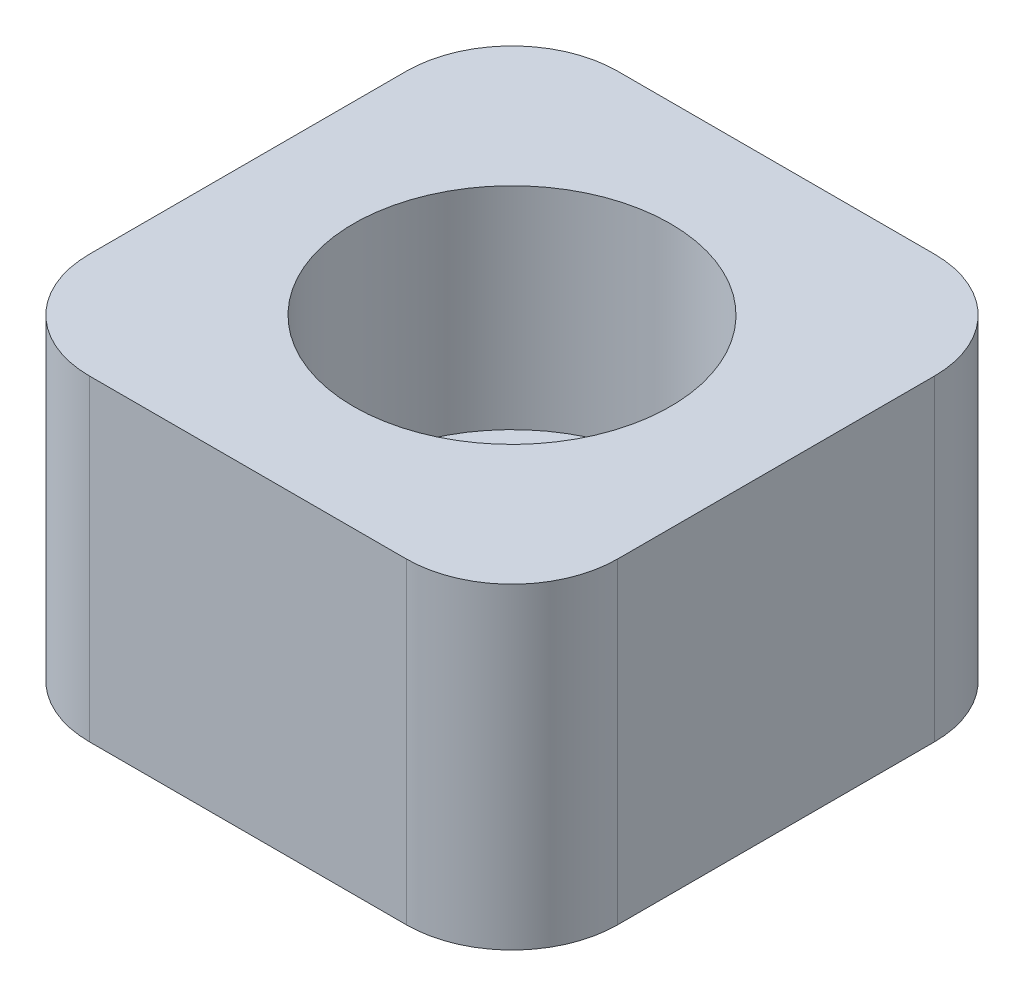
ISO-10303-21;
HEADER;
FILE_DESCRIPTION(('STEP AP214'),'2;1');
FILE_NAME('part.step','',(''),(''),'','','');
FILE_SCHEMA(('AUTOMOTIVE_DESIGN { 1 0 10303 214 1 1 1 1 }'));
ENDSEC;
DATA;
#1=APPLICATION_CONTEXT('core data for automotive mechanical design processes');
#2=APPLICATION_PROTOCOL_DEFINITION('international standard','automotive_design',2000,#1);
#3=PRODUCT_CONTEXT('',#1,'mechanical');
#4=PRODUCT('Part','Part','',(#3));
#5=PRODUCT_RELATED_PRODUCT_CATEGORY('part','',(#4));
#6=PRODUCT_DEFINITION_FORMATION('','',#4);
#7=PRODUCT_DEFINITION_CONTEXT('part definition',#1,'design');
#8=PRODUCT_DEFINITION('design','',#6,#7);
#9=PRODUCT_DEFINITION_SHAPE('','',#8);
#10=(LENGTH_UNIT() NAMED_UNIT(*) SI_UNIT(.MILLI.,.METRE.));
#11=(NAMED_UNIT(*) PLANE_ANGLE_UNIT() SI_UNIT($,.RADIAN.));
#12=(NAMED_UNIT(*) SI_UNIT($,.STERADIAN.) SOLID_ANGLE_UNIT());
#13=UNCERTAINTY_MEASURE_WITH_UNIT(LENGTH_MEASURE(1.E-05),#10,'distance_accuracy_value','');
#14=(GEOMETRIC_REPRESENTATION_CONTEXT(3) GLOBAL_UNCERTAINTY_ASSIGNED_CONTEXT((#13)) GLOBAL_UNIT_ASSIGNED_CONTEXT((#10,
#11,#12)) REPRESENTATION_CONTEXT('',''));
#15=CARTESIAN_POINT('',(0.,0.,0.));
#16=DIRECTION('',(0.,0.,1.));
#17=DIRECTION('',(1.,0.,0.));
#18=AXIS2_PLACEMENT_3D('',#15,#16,#17);
#19=CARTESIAN_POINT('',(25.,30.,25.));
#20=DIRECTION('',(-1.,0.,0.));
#21=DIRECTION('',(0.,0.,1.));
#22=AXIS2_PLACEMENT_3D('',#19,#20,#21);
#23=PLANE('',#22);
#24=DIRECTION('',(0.,0.,-1.));
#25=VECTOR('',#24,1.);
#26=CARTESIAN_POINT('',(25.,30.,25.));
#27=LINE('',#26,#25);
#28=CARTESIAN_POINT('',(25.,30.,15.));
#29=VERTEX_POINT('',#28);
#30=CARTESIAN_POINT('',(25.,30.,-15.));
#31=VERTEX_POINT('',#30);
#32=EDGE_CURVE('E134',#29,#31,#27,.T.);
#33=ORIENTED_EDGE('',*,*,#32,.F.);
#34=DIRECTION('',(0.,-1.,0.));
#35=VECTOR('',#34,1.);
#36=CARTESIAN_POINT('',(25.,30.,15.));
#37=LINE('',#36,#35);
#38=CARTESIAN_POINT('',(25.,0.,15.));
#39=VERTEX_POINT('',#38);
#40=EDGE_CURVE('E173',#29,#39,#37,.T.);
#41=ORIENTED_EDGE('',*,*,#40,.T.);
#42=DIRECTION('',(0.,0.,-1.));
#43=VECTOR('',#42,1.);
#44=CARTESIAN_POINT('',(25.,0.,25.));
#45=LINE('',#44,#43);
#46=CARTESIAN_POINT('',(25.,0.,-15.));
#47=VERTEX_POINT('',#46);
#48=EDGE_CURVE('E188',#39,#47,#45,.T.);
#49=ORIENTED_EDGE('',*,*,#48,.T.);
#50=DIRECTION('',(0.,-1.,0.));
#51=VECTOR('',#50,1.);
#52=CARTESIAN_POINT('',(25.,30.,-15.));
#53=LINE('',#52,#51);
#54=EDGE_CURVE('E170',#47,#31,#53,.F.);
#55=ORIENTED_EDGE('',*,*,#54,.T.);
#56=EDGE_LOOP('',(#33,#41,#49,#55));
#57=FACE_BOUND('',#56,.T.);
#58=ADVANCED_FACE('F38',(#57),#23,.F.);
#59=CARTESIAN_POINT('',(-25.,30.,-25.));
#60=DIRECTION('',(0.,0.,1.));
#61=DIRECTION('',(1.,0.,0.));
#62=AXIS2_PLACEMENT_3D('',#59,#60,#61);
#63=PLANE('',#62);
#64=DIRECTION('',(-1.,0.,0.));
#65=VECTOR('',#64,1.);
#66=CARTESIAN_POINT('',(-25.,30.,-25.));
#67=LINE('',#66,#65);
#68=CARTESIAN_POINT('',(15.,30.,-25.));
#69=VERTEX_POINT('',#68);
#70=CARTESIAN_POINT('',(-15.,30.,-25.));
#71=VERTEX_POINT('',#70);
#72=EDGE_CURVE('E139',#69,#71,#67,.T.);
#73=ORIENTED_EDGE('',*,*,#72,.F.);
#74=DIRECTION('',(0.,-1.,0.));
#75=VECTOR('',#74,1.);
#76=CARTESIAN_POINT('',(15.,30.,-25.));
#77=LINE('',#76,#75);
#78=CARTESIAN_POINT('',(15.,0.,-25.));
#79=VERTEX_POINT('',#78);
#80=EDGE_CURVE('E11',#69,#79,#77,.T.);
#81=ORIENTED_EDGE('',*,*,#80,.T.);
#82=DIRECTION('',(-1.,0.,0.));
#83=VECTOR('',#82,1.);
#84=CARTESIAN_POINT('',(-25.,0.,-25.));
#85=LINE('',#84,#83);
#86=CARTESIAN_POINT('',(-15.,0.,-25.));
#87=VERTEX_POINT('',#86);
#88=EDGE_CURVE('E141',#79,#87,#85,.T.);
#89=ORIENTED_EDGE('',*,*,#88,.T.);
#90=DIRECTION('',(0.,-1.,0.));
#91=VECTOR('',#90,1.);
#92=CARTESIAN_POINT('',(-15.,30.,-25.));
#93=LINE('',#92,#91);
#94=EDGE_CURVE('E47',#87,#71,#93,.F.);
#95=ORIENTED_EDGE('',*,*,#94,.T.);
#96=EDGE_LOOP('',(#73,#81,#89,#95));
#97=FACE_BOUND('',#96,.T.);
#98=ADVANCED_FACE('F194',(#97),#63,.F.);
#99=CARTESIAN_POINT('',(-25.,30.,25.));
#100=DIRECTION('',(1.,0.,0.));
#101=DIRECTION('',(0.,0.,-1.));
#102=AXIS2_PLACEMENT_3D('',#99,#100,#101);
#103=PLANE('',#102);
#104=DIRECTION('',(0.,0.,1.));
#105=VECTOR('',#104,1.);
#106=CARTESIAN_POINT('',(-25.,0.,25.));
#107=LINE('',#106,#105);
#108=CARTESIAN_POINT('',(-25.,0.,-15.));
#109=VERTEX_POINT('',#108);
#110=CARTESIAN_POINT('',(-25.,0.,15.));
#111=VERTEX_POINT('',#110);
#112=EDGE_CURVE('E135',#109,#111,#107,.T.);
#113=ORIENTED_EDGE('',*,*,#112,.T.);
#114=DIRECTION('',(0.,-1.,0.));
#115=VECTOR('',#114,1.);
#116=CARTESIAN_POINT('',(-25.,30.,15.));
#117=LINE('',#116,#115);
#118=CARTESIAN_POINT('',(-25.,30.,15.));
#119=VERTEX_POINT('',#118);
#120=EDGE_CURVE('E110',#111,#119,#117,.F.);
#121=ORIENTED_EDGE('',*,*,#120,.T.);
#122=DIRECTION('',(0.,0.,1.));
#123=VECTOR('',#122,1.);
#124=CARTESIAN_POINT('',(-25.,30.,25.));
#125=LINE('',#124,#123);
#126=CARTESIAN_POINT('',(-25.,30.,-15.));
#127=VERTEX_POINT('',#126);
#128=EDGE_CURVE('E179',#127,#119,#125,.T.);
#129=ORIENTED_EDGE('',*,*,#128,.F.);
#130=DIRECTION('',(0.,-1.,0.));
#131=VECTOR('',#130,1.);
#132=CARTESIAN_POINT('',(-25.,30.,-15.));
#133=LINE('',#132,#131);
#134=EDGE_CURVE('E116',#127,#109,#133,.T.);
#135=ORIENTED_EDGE('',*,*,#134,.T.);
#136=EDGE_LOOP('',(#113,#121,#129,#135));
#137=FACE_BOUND('',#136,.T.);
#138=ADVANCED_FACE('F201',(#137),#103,.F.);
#139=CARTESIAN_POINT('',(-25.,30.,25.));
#140=DIRECTION('',(0.,0.,-1.));
#141=DIRECTION('',(-1.,0.,0.));
#142=AXIS2_PLACEMENT_3D('',#139,#140,#141);
#143=PLANE('',#142);
#144=DIRECTION('',(1.,0.,0.));
#145=VECTOR('',#144,1.);
#146=CARTESIAN_POINT('',(-25.,30.,25.));
#147=LINE('',#146,#145);
#148=CARTESIAN_POINT('',(-15.,30.,25.));
#149=VERTEX_POINT('',#148);
#150=CARTESIAN_POINT('',(15.,30.,25.));
#151=VERTEX_POINT('',#150);
#152=EDGE_CURVE('E126',#149,#151,#147,.T.);
#153=ORIENTED_EDGE('',*,*,#152,.F.);
#154=DIRECTION('',(0.,-1.,0.));
#155=VECTOR('',#154,1.);
#156=CARTESIAN_POINT('',(-15.,30.,25.));
#157=LINE('',#156,#155);
#158=CARTESIAN_POINT('',(-15.,0.,25.));
#159=VERTEX_POINT('',#158);
#160=EDGE_CURVE('E109',#149,#159,#157,.T.);
#161=ORIENTED_EDGE('',*,*,#160,.T.);
#162=DIRECTION('',(1.,0.,0.));
#163=VECTOR('',#162,1.);
#164=CARTESIAN_POINT('',(-25.,0.,25.));
#165=LINE('',#164,#163);
#166=CARTESIAN_POINT('',(15.,0.,25.));
#167=VERTEX_POINT('',#166);
#168=EDGE_CURVE('E123',#159,#167,#165,.T.);
#169=ORIENTED_EDGE('',*,*,#168,.T.);
#170=DIRECTION('',(0.,-1.,0.));
#171=VECTOR('',#170,1.);
#172=CARTESIAN_POINT('',(15.,30.,25.));
#173=LINE('',#172,#171);
#174=EDGE_CURVE('E129',#167,#151,#173,.F.);
#175=ORIENTED_EDGE('',*,*,#174,.T.);
#176=EDGE_LOOP('',(#153,#161,#169,#175));
#177=FACE_BOUND('',#176,.T.);
#178=ADVANCED_FACE('F122',(#177),#143,.F.);
#179=CARTESIAN_POINT('',(0.,30.,0.));
#180=DIRECTION('',(0.,-1.,0.));
#181=DIRECTION('',(0.,0.,-1.));
#182=AXIS2_PLACEMENT_3D('',#179,#180,#181);
#183=PLANE('',#182);
#184=CARTESIAN_POINT('',(0.,30.,0.));
#185=DIRECTION('',(0.,1.,0.));
#186=DIRECTION('',(0.,0.,1.));
#187=AXIS2_PLACEMENT_3D('',#184,#185,#186);
#188=CIRCLE('',#187,15.);
#189=CARTESIAN_POINT('',(0.,30.,15.));
#190=VERTEX_POINT('',#189);
#191=EDGE_CURVE('E286',#190,#190,#188,.T.);
#192=ORIENTED_EDGE('',*,*,#191,.F.);
#193=EDGE_LOOP('',(#192));
#194=FACE_BOUND('',#193,.T.);
#195=ORIENTED_EDGE('',*,*,#128,.T.);
#196=CARTESIAN_POINT('',(-15.,30.,15.));
#197=DIRECTION('',(0.,-1.,0.));
#198=DIRECTION('',(0.,0.,-1.));
#199=AXIS2_PLACEMENT_3D('',#196,#197,#198);
#200=CIRCLE('',#199,10.);
#201=EDGE_CURVE('E167',#119,#149,#200,.F.);
#202=ORIENTED_EDGE('',*,*,#201,.T.);
#203=ORIENTED_EDGE('',*,*,#152,.T.);
#204=CARTESIAN_POINT('',(15.,30.,15.));
#205=DIRECTION('',(0.,-1.,0.));
#206=DIRECTION('',(0.,0.,-1.));
#207=AXIS2_PLACEMENT_3D('',#204,#205,#206);
#208=CIRCLE('',#207,10.);
#209=EDGE_CURVE('E164',#151,#29,#208,.F.);
#210=ORIENTED_EDGE('',*,*,#209,.T.);
#211=ORIENTED_EDGE('',*,*,#32,.T.);
#212=CARTESIAN_POINT('',(15.,30.,-15.));
#213=DIRECTION('',(0.,-1.,0.));
#214=DIRECTION('',(0.,0.,-1.));
#215=AXIS2_PLACEMENT_3D('',#212,#213,#214);
#216=CIRCLE('',#215,10.);
#217=EDGE_CURVE('E60',#31,#69,#216,.F.);
#218=ORIENTED_EDGE('',*,*,#217,.T.);
#219=ORIENTED_EDGE('',*,*,#72,.T.);
#220=CARTESIAN_POINT('',(-15.,30.,-15.));
#221=DIRECTION('',(0.,-1.,0.));
#222=DIRECTION('',(0.,0.,-1.));
#223=AXIS2_PLACEMENT_3D('',#220,#221,#222);
#224=CIRCLE('',#223,10.);
#225=EDGE_CURVE('E159',#71,#127,#224,.F.);
#226=ORIENTED_EDGE('',*,*,#225,.T.);
#227=EDGE_LOOP('',(#195,#202,#203,#210,#211,#218,#219,#226));
#228=FACE_BOUND('',#227,.T.);
#229=ADVANCED_FACE('F199',(#194,#228),#183,.F.);
#230=CARTESIAN_POINT('',(0.,0.,0.));
#231=DIRECTION('',(0.,-1.,0.));
#232=DIRECTION('',(0.,0.,-1.));
#233=AXIS2_PLACEMENT_3D('',#230,#231,#232);
#234=PLANE('',#233);
#235=CARTESIAN_POINT('',(15.,0.,15.));
#236=DIRECTION('',(0.,-1.,0.));
#237=DIRECTION('',(0.,0.,-1.));
#238=AXIS2_PLACEMENT_3D('',#235,#236,#237);
#239=CIRCLE('',#238,3.);
#240=CARTESIAN_POINT('',(15.,0.,12.));
#241=VERTEX_POINT('',#240);
#242=EDGE_CURVE('E267',#241,#241,#239,.T.);
#243=ORIENTED_EDGE('',*,*,#242,.F.);
#244=EDGE_LOOP('',(#243));
#245=FACE_BOUND('',#244,.T.);
#246=CARTESIAN_POINT('',(-15.,0.,15.));
#247=DIRECTION('',(0.,-1.,0.));
#248=DIRECTION('',(0.,0.,-1.));
#249=AXIS2_PLACEMENT_3D('',#246,#247,#248);
#250=CIRCLE('',#249,3.);
#251=CARTESIAN_POINT('',(-15.,0.,12.));
#252=VERTEX_POINT('',#251);
#253=EDGE_CURVE('E271',#252,#252,#250,.T.);
#254=ORIENTED_EDGE('',*,*,#253,.F.);
#255=EDGE_LOOP('',(#254));
#256=FACE_BOUND('',#255,.T.);
#257=CARTESIAN_POINT('',(-15.,0.,-15.));
#258=DIRECTION('',(0.,-1.,0.));
#259=DIRECTION('',(0.,0.,-1.));
#260=AXIS2_PLACEMENT_3D('',#257,#258,#259);
#261=CIRCLE('',#260,3.);
#262=CARTESIAN_POINT('',(-15.,0.,-18.));
#263=VERTEX_POINT('',#262);
#264=EDGE_CURVE('E275',#263,#263,#261,.T.);
#265=ORIENTED_EDGE('',*,*,#264,.F.);
#266=EDGE_LOOP('',(#265));
#267=FACE_BOUND('',#266,.T.);
#268=CARTESIAN_POINT('',(15.,0.,-15.));
#269=DIRECTION('',(0.,-1.,0.));
#270=DIRECTION('',(0.,0.,-1.));
#271=AXIS2_PLACEMENT_3D('',#268,#269,#270);
#272=CIRCLE('',#271,3.);
#273=CARTESIAN_POINT('',(15.,0.,-18.));
#274=VERTEX_POINT('',#273);
#275=EDGE_CURVE('E278',#274,#274,#272,.T.);
#276=ORIENTED_EDGE('',*,*,#275,.F.);
#277=EDGE_LOOP('',(#276));
#278=FACE_BOUND('',#277,.T.);
#279=ORIENTED_EDGE('',*,*,#168,.F.);
#280=CARTESIAN_POINT('',(-15.,0.,15.));
#281=DIRECTION('',(0.,-1.,0.));
#282=DIRECTION('',(0.,0.,-1.));
#283=AXIS2_PLACEMENT_3D('',#280,#281,#282);
#284=CIRCLE('',#283,10.);
#285=EDGE_CURVE('E105',#159,#111,#284,.T.);
#286=ORIENTED_EDGE('',*,*,#285,.T.);
#287=ORIENTED_EDGE('',*,*,#112,.F.);
#288=CARTESIAN_POINT('',(-15.,0.,-15.));
#289=DIRECTION('',(0.,-1.,0.));
#290=DIRECTION('',(0.,0.,-1.));
#291=AXIS2_PLACEMENT_3D('',#288,#289,#290);
#292=CIRCLE('',#291,10.);
#293=EDGE_CURVE('E128',#109,#87,#292,.T.);
#294=ORIENTED_EDGE('',*,*,#293,.T.);
#295=ORIENTED_EDGE('',*,*,#88,.F.);
#296=CARTESIAN_POINT('',(15.,0.,-15.));
#297=DIRECTION('',(0.,-1.,0.));
#298=DIRECTION('',(0.,0.,-1.));
#299=AXIS2_PLACEMENT_3D('',#296,#297,#298);
#300=CIRCLE('',#299,10.);
#301=EDGE_CURVE('E149',#79,#47,#300,.T.);
#302=ORIENTED_EDGE('',*,*,#301,.T.);
#303=ORIENTED_EDGE('',*,*,#48,.F.);
#304=CARTESIAN_POINT('',(15.,0.,15.));
#305=DIRECTION('',(0.,-1.,0.));
#306=DIRECTION('',(0.,0.,-1.));
#307=AXIS2_PLACEMENT_3D('',#304,#305,#306);
#308=CIRCLE('',#307,10.);
#309=EDGE_CURVE('E117',#39,#167,#308,.T.);
#310=ORIENTED_EDGE('',*,*,#309,.T.);
#311=EDGE_LOOP('',(#279,#286,#287,#294,#295,#302,#303,#310));
#312=FACE_BOUND('',#311,.T.);
#313=ADVANCED_FACE('F131',(#245,#256,#267,#278,#312),#234,.T.);
#314=CARTESIAN_POINT('',(0.,10.,0.));
#315=DIRECTION('',(0.,1.,0.));
#316=DIRECTION('',(0.,0.,1.));
#317=AXIS2_PLACEMENT_3D('',#314,#315,#316);
#318=CYLINDRICAL_SURFACE('',#317,15.);
#319=CARTESIAN_POINT('',(0.,10.,0.));
#320=DIRECTION('',(0.,1.,0.));
#321=DIRECTION('',(0.,0.,1.));
#322=AXIS2_PLACEMENT_3D('',#319,#320,#321);
#323=CIRCLE('',#322,15.);
#324=CARTESIAN_POINT('',(0.,10.,15.));
#325=VERTEX_POINT('',#324);
#326=EDGE_CURVE('E191',#325,#325,#323,.T.);
#327=ORIENTED_EDGE('',*,*,#326,.F.);
#328=EDGE_LOOP('',(#327));
#329=FACE_BOUND('',#328,.T.);
#330=ORIENTED_EDGE('',*,*,#191,.T.);
#331=EDGE_LOOP('',(#330));
#332=FACE_BOUND('',#331,.T.);
#333=ADVANCED_FACE('F252',(#329,#332),#318,.F.);
#334=CARTESIAN_POINT('',(0.,10.,0.));
#335=DIRECTION('',(0.,1.,0.));
#336=DIRECTION('',(0.,0.,1.));
#337=AXIS2_PLACEMENT_3D('',#334,#335,#336);
#338=PLANE('',#337);
#339=ORIENTED_EDGE('',*,*,#326,.T.);
#340=EDGE_LOOP('',(#339));
#341=FACE_BOUND('',#340,.T.);
#342=ADVANCED_FACE('F221',(#341),#338,.T.);
#343=CARTESIAN_POINT('',(-15.,30.,15.));
#344=DIRECTION('',(0.,-1.,0.));
#345=DIRECTION('',(0.,0.,-1.));
#346=AXIS2_PLACEMENT_3D('',#343,#344,#345);
#347=CYLINDRICAL_SURFACE('',#346,10.);
#348=ORIENTED_EDGE('',*,*,#201,.F.);
#349=ORIENTED_EDGE('',*,*,#120,.F.);
#350=ORIENTED_EDGE('',*,*,#285,.F.);
#351=ORIENTED_EDGE('',*,*,#160,.F.);
#352=EDGE_LOOP('',(#348,#349,#350,#351));
#353=FACE_BOUND('',#352,.T.);
#354=ADVANCED_FACE('F108',(#353),#347,.T.);
#355=CARTESIAN_POINT('',(15.,30.,15.));
#356=DIRECTION('',(0.,-1.,0.));
#357=DIRECTION('',(0.,0.,-1.));
#358=AXIS2_PLACEMENT_3D('',#355,#356,#357);
#359=CYLINDRICAL_SURFACE('',#358,10.);
#360=ORIENTED_EDGE('',*,*,#209,.F.);
#361=ORIENTED_EDGE('',*,*,#174,.F.);
#362=ORIENTED_EDGE('',*,*,#309,.F.);
#363=ORIENTED_EDGE('',*,*,#40,.F.);
#364=EDGE_LOOP('',(#360,#361,#362,#363));
#365=FACE_BOUND('',#364,.T.);
#366=ADVANCED_FACE('F220',(#365),#359,.T.);
#367=CARTESIAN_POINT('',(15.,30.,-15.));
#368=DIRECTION('',(0.,-1.,0.));
#369=DIRECTION('',(0.,0.,-1.));
#370=AXIS2_PLACEMENT_3D('',#367,#368,#369);
#371=CYLINDRICAL_SURFACE('',#370,10.);
#372=ORIENTED_EDGE('',*,*,#217,.F.);
#373=ORIENTED_EDGE('',*,*,#54,.F.);
#374=ORIENTED_EDGE('',*,*,#301,.F.);
#375=ORIENTED_EDGE('',*,*,#80,.F.);
#376=EDGE_LOOP('',(#372,#373,#374,#375));
#377=FACE_BOUND('',#376,.T.);
#378=ADVANCED_FACE('F223',(#377),#371,.T.);
#379=CARTESIAN_POINT('',(-15.,30.,-15.));
#380=DIRECTION('',(0.,-1.,0.));
#381=DIRECTION('',(0.,0.,-1.));
#382=AXIS2_PLACEMENT_3D('',#379,#380,#381);
#383=CYLINDRICAL_SURFACE('',#382,10.);
#384=ORIENTED_EDGE('',*,*,#225,.F.);
#385=ORIENTED_EDGE('',*,*,#94,.F.);
#386=ORIENTED_EDGE('',*,*,#293,.F.);
#387=ORIENTED_EDGE('',*,*,#134,.F.);
#388=EDGE_LOOP('',(#384,#385,#386,#387));
#389=FACE_BOUND('',#388,.T.);
#390=ADVANCED_FACE('F40',(#389),#383,.T.);
#391=CARTESIAN_POINT('',(15.,10.,-15.));
#392=DIRECTION('',(0.,-1.,0.));
#393=DIRECTION('',(0.,0.,-1.));
#394=AXIS2_PLACEMENT_3D('',#391,#392,#393);
#395=CYLINDRICAL_SURFACE('',#394,3.);
#396=CARTESIAN_POINT('',(15.,10.,-15.));
#397=DIRECTION('',(0.,-1.,0.));
#398=DIRECTION('',(0.,0.,-1.));
#399=AXIS2_PLACEMENT_3D('',#396,#397,#398);
#400=CIRCLE('',#399,3.);
#401=CARTESIAN_POINT('',(15.,10.,-18.));
#402=VERTEX_POINT('',#401);
#403=EDGE_CURVE('E280',#402,#402,#400,.T.);
#404=ORIENTED_EDGE('',*,*,#403,.F.);
#405=EDGE_LOOP('',(#404));
#406=FACE_BOUND('',#405,.T.);
#407=ORIENTED_EDGE('',*,*,#275,.T.);
#408=EDGE_LOOP('',(#407));
#409=FACE_BOUND('',#408,.T.);
#410=ADVANCED_FACE('F230',(#406,#409),#395,.F.);
#411=CARTESIAN_POINT('',(15.,10.,-15.));
#412=DIRECTION('',(0.,-1.,0.));
#413=DIRECTION('',(0.,0.,-1.));
#414=AXIS2_PLACEMENT_3D('',#411,#412,#413);
#415=PLANE('',#414);
#416=ORIENTED_EDGE('',*,*,#403,.T.);
#417=EDGE_LOOP('',(#416));
#418=FACE_BOUND('',#417,.T.);
#419=ADVANCED_FACE('F237',(#418),#415,.T.);
#420=CARTESIAN_POINT('',(-15.,10.,-15.));
#421=DIRECTION('',(0.,-1.,0.));
#422=DIRECTION('',(0.,0.,-1.));
#423=AXIS2_PLACEMENT_3D('',#420,#421,#422);
#424=CYLINDRICAL_SURFACE('',#423,3.);
#425=CARTESIAN_POINT('',(-15.,10.,-15.));
#426=DIRECTION('',(0.,-1.,0.));
#427=DIRECTION('',(0.,0.,-1.));
#428=AXIS2_PLACEMENT_3D('',#425,#426,#427);
#429=CIRCLE('',#428,3.);
#430=CARTESIAN_POINT('',(-15.,10.,-18.));
#431=VERTEX_POINT('',#430);
#432=EDGE_CURVE('E281',#431,#431,#429,.T.);
#433=ORIENTED_EDGE('',*,*,#432,.F.);
#434=EDGE_LOOP('',(#433));
#435=FACE_BOUND('',#434,.T.);
#436=ORIENTED_EDGE('',*,*,#264,.T.);
#437=EDGE_LOOP('',(#436));
#438=FACE_BOUND('',#437,.T.);
#439=ADVANCED_FACE('F243',(#435,#438),#424,.F.);
#440=CARTESIAN_POINT('',(-15.,10.,-15.));
#441=DIRECTION('',(0.,-1.,0.));
#442=DIRECTION('',(0.,0.,-1.));
#443=AXIS2_PLACEMENT_3D('',#440,#441,#442);
#444=PLANE('',#443);
#445=ORIENTED_EDGE('',*,*,#432,.T.);
#446=EDGE_LOOP('',(#445));
#447=FACE_BOUND('',#446,.T.);
#448=ADVANCED_FACE('F314',(#447),#444,.T.);
#449=CARTESIAN_POINT('',(-15.,10.,15.));
#450=DIRECTION('',(0.,-1.,0.));
#451=DIRECTION('',(0.,0.,-1.));
#452=AXIS2_PLACEMENT_3D('',#449,#450,#451);
#453=CYLINDRICAL_SURFACE('',#452,3.);
#454=CARTESIAN_POINT('',(-15.,10.,15.));
#455=DIRECTION('',(0.,-1.,0.));
#456=DIRECTION('',(0.,0.,-1.));
#457=AXIS2_PLACEMENT_3D('',#454,#455,#456);
#458=CIRCLE('',#457,3.);
#459=CARTESIAN_POINT('',(-15.,10.,12.));
#460=VERTEX_POINT('',#459);
#461=EDGE_CURVE('E307',#460,#460,#458,.T.);
#462=ORIENTED_EDGE('',*,*,#461,.F.);
#463=EDGE_LOOP('',(#462));
#464=FACE_BOUND('',#463,.T.);
#465=ORIENTED_EDGE('',*,*,#253,.T.);
#466=EDGE_LOOP('',(#465));
#467=FACE_BOUND('',#466,.T.);
#468=ADVANCED_FACE('F320',(#464,#467),#453,.F.);
#469=CARTESIAN_POINT('',(-15.,10.,15.));
#470=DIRECTION('',(0.,-1.,0.));
#471=DIRECTION('',(0.,0.,-1.));
#472=AXIS2_PLACEMENT_3D('',#469,#470,#471);
#473=PLANE('',#472);
#474=ORIENTED_EDGE('',*,*,#461,.T.);
#475=EDGE_LOOP('',(#474));
#476=FACE_BOUND('',#475,.T.);
#477=ADVANCED_FACE('F325',(#476),#473,.T.);
#478=CARTESIAN_POINT('',(15.,10.,15.));
#479=DIRECTION('',(0.,-1.,0.));
#480=DIRECTION('',(0.,0.,-1.));
#481=AXIS2_PLACEMENT_3D('',#478,#479,#480);
#482=CYLINDRICAL_SURFACE('',#481,3.);
#483=CARTESIAN_POINT('',(15.,10.,15.));
#484=DIRECTION('',(0.,-1.,0.));
#485=DIRECTION('',(0.,0.,-1.));
#486=AXIS2_PLACEMENT_3D('',#483,#484,#485);
#487=CIRCLE('',#486,3.);
#488=CARTESIAN_POINT('',(15.,10.,12.));
#489=VERTEX_POINT('',#488);
#490=EDGE_CURVE('E301',#489,#489,#487,.T.);
#491=ORIENTED_EDGE('',*,*,#490,.F.);
#492=EDGE_LOOP('',(#491));
#493=FACE_BOUND('',#492,.T.);
#494=ORIENTED_EDGE('',*,*,#242,.T.);
#495=EDGE_LOOP('',(#494));
#496=FACE_BOUND('',#495,.T.);
#497=ADVANCED_FACE('F328',(#493,#496),#482,.F.);
#498=CARTESIAN_POINT('',(15.,10.,15.));
#499=DIRECTION('',(0.,-1.,0.));
#500=DIRECTION('',(0.,0.,-1.));
#501=AXIS2_PLACEMENT_3D('',#498,#499,#500);
#502=PLANE('',#501);
#503=ORIENTED_EDGE('',*,*,#490,.T.);
#504=EDGE_LOOP('',(#503));
#505=FACE_BOUND('',#504,.T.);
#506=ADVANCED_FACE('F333',(#505),#502,.T.);
#507=CLOSED_SHELL('',(#58,#98,#138,#178,#229,#313,#333,#342,#354,#366,#378,#390,#410,#419,#439,
#448,#468,#477,#497,#506));
#508=MANIFOLD_SOLID_BREP('B2',#507);
#509=ADVANCED_BREP_SHAPE_REPRESENTATION('',(#18,#508),#14);
#510=SHAPE_DEFINITION_REPRESENTATION(#9,#509);
ENDSEC;
END-ISO-10303-21;
